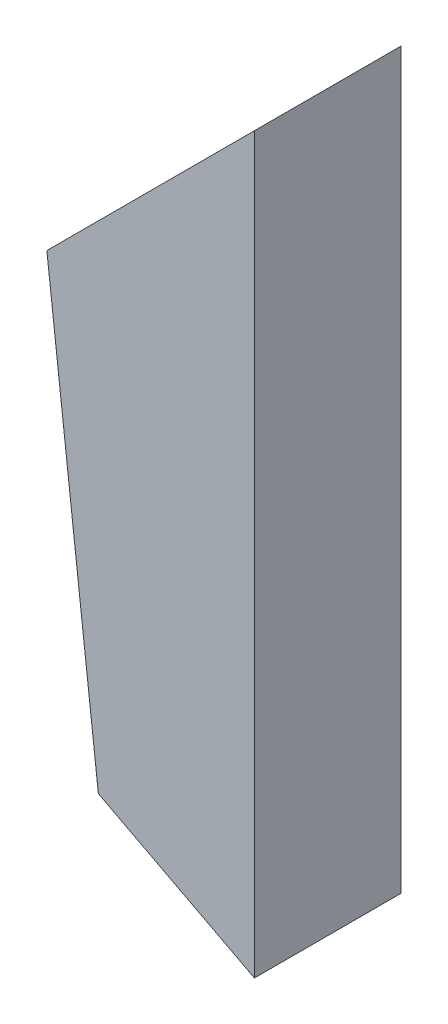
ISO-10303-21;
HEADER;
FILE_DESCRIPTION(('STEP AP214'),'2;1');
FILE_NAME('part.step','',(''),(''),'','','');
FILE_SCHEMA(('AUTOMOTIVE_DESIGN { 1 0 10303 214 1 1 1 1 }'));
ENDSEC;
DATA;
#1=APPLICATION_CONTEXT('core data for automotive mechanical design processes');
#2=APPLICATION_PROTOCOL_DEFINITION('international standard','automotive_design',2000,#1);
#3=PRODUCT_CONTEXT('',#1,'mechanical');
#4=PRODUCT('Part','Part','',(#3));
#5=PRODUCT_RELATED_PRODUCT_CATEGORY('part','',(#4));
#6=PRODUCT_DEFINITION_FORMATION('','',#4);
#7=PRODUCT_DEFINITION_CONTEXT('part definition',#1,'design');
#8=PRODUCT_DEFINITION('design','',#6,#7);
#9=PRODUCT_DEFINITION_SHAPE('','',#8);
#10=(LENGTH_UNIT() NAMED_UNIT(*) SI_UNIT(.MILLI.,.METRE.));
#11=(NAMED_UNIT(*) PLANE_ANGLE_UNIT() SI_UNIT($,.RADIAN.));
#12=(NAMED_UNIT(*) SI_UNIT($,.STERADIAN.) SOLID_ANGLE_UNIT());
#13=UNCERTAINTY_MEASURE_WITH_UNIT(LENGTH_MEASURE(1.E-05),#10,'distance_accuracy_value','');
#14=(GEOMETRIC_REPRESENTATION_CONTEXT(3) GLOBAL_UNCERTAINTY_ASSIGNED_CONTEXT((#13)) GLOBAL_UNIT_ASSIGNED_CONTEXT((#10,
#11,#12)) REPRESENTATION_CONTEXT('',''));
#15=CARTESIAN_POINT('',(0.,0.,0.));
#16=DIRECTION('',(0.,0.,1.));
#17=DIRECTION('',(1.,0.,0.));
#18=AXIS2_PLACEMENT_3D('',#15,#16,#17);
#19=CARTESIAN_POINT('',(3.50999790711884,-30.293904673414,10.));
#20=DIRECTION('',(0.993354507122263,0.115094844280213,0.));
#21=DIRECTION('',(-0.115094844280213,0.993354507122263,0.));
#22=AXIS2_PLACEMENT_3D('',#19,#20,#21);
#23=PLANE('',#22);
#24=DIRECTION('',(0.115094844280213,-0.993354507122263,0.));
#25=VECTOR('',#24,1.);
#26=CARTESIAN_POINT('',(3.50999790711884,-30.293904673414,0.));
#27=LINE('',#26,#25);
#28=CARTESIAN_POINT('',(0.,0.,0.));
#29=VERTEX_POINT('',#28);
#30=CARTESIAN_POINT('',(3.50999790711884,-30.293904673414,0.));
#31=VERTEX_POINT('',#30);
#32=EDGE_CURVE('E96',#29,#31,#27,.T.);
#33=ORIENTED_EDGE('',*,*,#32,.T.);
#34=DIRECTION('',(0.,0.,-1.));
#35=VECTOR('',#34,1.);
#36=CARTESIAN_POINT('',(3.50999790711884,-30.293904673414,10.));
#37=LINE('',#36,#35);
#38=CARTESIAN_POINT('',(3.50999790711884,-30.293904673414,10.));
#39=VERTEX_POINT('',#38);
#40=EDGE_CURVE('E11',#39,#31,#37,.T.);
#41=ORIENTED_EDGE('',*,*,#40,.F.);
#42=DIRECTION('',(0.115094844280213,-0.993354507122263,0.));
#43=VECTOR('',#42,1.);
#44=CARTESIAN_POINT('',(3.50999790711884,-30.293904673414,10.));
#45=LINE('',#44,#43);
#46=CARTESIAN_POINT('',(0.,0.,10.));
#47=VERTEX_POINT('',#46);
#48=EDGE_CURVE('E84',#47,#39,#45,.T.);
#49=ORIENTED_EDGE('',*,*,#48,.F.);
#50=DIRECTION('',(0.,0.,-1.));
#51=VECTOR('',#50,1.);
#52=CARTESIAN_POINT('',(0.,0.,10.));
#53=LINE('',#52,#51);
#54=EDGE_CURVE('E92',#47,#29,#53,.T.);
#55=ORIENTED_EDGE('',*,*,#54,.T.);
#56=EDGE_LOOP('',(#33,#41,#49,#55));
#57=FACE_BOUND('',#56,.T.);
#58=ADVANCED_FACE('F33',(#57),#23,.F.);
#59=CARTESIAN_POINT('',(14.1421356237309,-35.857864376269,10.));
#60=DIRECTION('',(0.463663308571252,0.886011476384341,0.));
#61=DIRECTION('',(-0.886011476384341,0.463663308571252,0.));
#62=AXIS2_PLACEMENT_3D('',#59,#60,#61);
#63=PLANE('',#62);
#64=DIRECTION('',(0.886011476384341,-0.463663308571252,0.));
#65=VECTOR('',#64,1.);
#66=CARTESIAN_POINT('',(14.1421356237309,-35.857864376269,0.));
#67=LINE('',#66,#65);
#68=CARTESIAN_POINT('',(14.1421356237309,-35.857864376269,0.));
#69=VERTEX_POINT('',#68);
#70=EDGE_CURVE('E88',#31,#69,#67,.T.);
#71=ORIENTED_EDGE('',*,*,#70,.T.);
#72=DIRECTION('',(0.,0.,-1.));
#73=VECTOR('',#72,1.);
#74=CARTESIAN_POINT('',(14.1421356237309,-35.857864376269,10.));
#75=LINE('',#74,#73);
#76=CARTESIAN_POINT('',(14.1421356237309,-35.857864376269,10.));
#77=VERTEX_POINT('',#76);
#78=EDGE_CURVE('E41',#77,#69,#75,.T.);
#79=ORIENTED_EDGE('',*,*,#78,.F.);
#80=DIRECTION('',(0.886011476384341,-0.463663308571252,0.));
#81=VECTOR('',#80,1.);
#82=CARTESIAN_POINT('',(14.1421356237309,-35.857864376269,10.));
#83=LINE('',#82,#81);
#84=EDGE_CURVE('E79',#39,#77,#83,.T.);
#85=ORIENTED_EDGE('',*,*,#84,.F.);
#86=ORIENTED_EDGE('',*,*,#40,.T.);
#87=EDGE_LOOP('',(#71,#79,#85,#86));
#88=FACE_BOUND('',#87,.T.);
#89=ADVANCED_FACE('F87',(#88),#63,.F.);
#90=CARTESIAN_POINT('',(14.1421356237309,14.142135623731,10.));
#91=DIRECTION('',(-1.,0.,0.));
#92=DIRECTION('',(0.,-1.,0.));
#93=AXIS2_PLACEMENT_3D('',#90,#91,#92);
#94=PLANE('',#93);
#95=DIRECTION('',(0.,1.,0.));
#96=VECTOR('',#95,1.);
#97=CARTESIAN_POINT('',(14.1421356237309,14.142135623731,0.));
#98=LINE('',#97,#96);
#99=CARTESIAN_POINT('',(14.1421356237309,14.142135623731,0.));
#100=VERTEX_POINT('',#99);
#101=EDGE_CURVE('E66',#69,#100,#98,.T.);
#102=ORIENTED_EDGE('',*,*,#101,.T.);
#103=DIRECTION('',(0.,0.,-1.));
#104=VECTOR('',#103,1.);
#105=CARTESIAN_POINT('',(14.1421356237309,14.142135623731,10.));
#106=LINE('',#105,#104);
#107=CARTESIAN_POINT('',(14.1421356237309,14.142135623731,10.));
#108=VERTEX_POINT('',#107);
#109=EDGE_CURVE('E89',#108,#100,#106,.T.);
#110=ORIENTED_EDGE('',*,*,#109,.F.);
#111=DIRECTION('',(0.,1.,0.));
#112=VECTOR('',#111,1.);
#113=CARTESIAN_POINT('',(14.1421356237309,14.142135623731,10.));
#114=LINE('',#113,#112);
#115=EDGE_CURVE('E82',#77,#108,#114,.T.);
#116=ORIENTED_EDGE('',*,*,#115,.F.);
#117=ORIENTED_EDGE('',*,*,#78,.T.);
#118=EDGE_LOOP('',(#102,#110,#116,#117));
#119=FACE_BOUND('',#118,.T.);
#120=ADVANCED_FACE('F90',(#119),#94,.F.);
#121=CARTESIAN_POINT('',(0.,0.,10.));
#122=DIRECTION('',(0.707106781186549,-0.707106781186546,0.));
#123=DIRECTION('',(0.707106781186546,0.707106781186549,0.));
#124=AXIS2_PLACEMENT_3D('',#121,#122,#123);
#125=PLANE('',#124);
#126=DIRECTION('',(-0.707106781186546,-0.707106781186549,0.));
#127=VECTOR('',#126,1.);
#128=CARTESIAN_POINT('',(0.,0.,0.));
#129=LINE('',#128,#127);
#130=EDGE_CURVE('E72',#100,#29,#129,.T.);
#131=ORIENTED_EDGE('',*,*,#130,.T.);
#132=ORIENTED_EDGE('',*,*,#54,.F.);
#133=DIRECTION('',(-0.707106781186546,-0.707106781186549,0.));
#134=VECTOR('',#133,1.);
#135=CARTESIAN_POINT('',(0.,0.,10.));
#136=LINE('',#135,#134);
#137=EDGE_CURVE('E49',#108,#47,#136,.T.);
#138=ORIENTED_EDGE('',*,*,#137,.F.);
#139=ORIENTED_EDGE('',*,*,#109,.T.);
#140=EDGE_LOOP('',(#131,#132,#138,#139));
#141=FACE_BOUND('',#140,.T.);
#142=ADVANCED_FACE('F103',(#141),#125,.F.);
#143=CARTESIAN_POINT('',(0.,0.,10.));
#144=DIRECTION('',(0.,0.,1.));
#145=DIRECTION('',(1.,0.,0.));
#146=AXIS2_PLACEMENT_3D('',#143,#144,#145);
#147=PLANE('',#146);
#148=ORIENTED_EDGE('',*,*,#48,.T.);
#149=ORIENTED_EDGE('',*,*,#84,.T.);
#150=ORIENTED_EDGE('',*,*,#115,.T.);
#151=ORIENTED_EDGE('',*,*,#137,.T.);
#152=EDGE_LOOP('',(#148,#149,#150,#151));
#153=FACE_BOUND('',#152,.T.);
#154=ADVANCED_FACE('F80',(#153),#147,.T.);
#155=CARTESIAN_POINT('',(0.,0.,0.));
#156=DIRECTION('',(0.,0.,1.));
#157=DIRECTION('',(1.,0.,0.));
#158=AXIS2_PLACEMENT_3D('',#155,#156,#157);
#159=PLANE('',#158);
#160=ORIENTED_EDGE('',*,*,#32,.F.);
#161=ORIENTED_EDGE('',*,*,#130,.F.);
#162=ORIENTED_EDGE('',*,*,#101,.F.);
#163=ORIENTED_EDGE('',*,*,#70,.F.);
#164=EDGE_LOOP('',(#160,#161,#162,#163));
#165=FACE_BOUND('',#164,.T.);
#166=ADVANCED_FACE('F106',(#165),#159,.F.);
#167=CLOSED_SHELL('',(#58,#89,#120,#142,#154,#166));
#168=MANIFOLD_SOLID_BREP('B2',#167);
#169=ADVANCED_BREP_SHAPE_REPRESENTATION('',(#18,#168),#14);
#170=SHAPE_DEFINITION_REPRESENTATION(#9,#169);
ENDSEC;
END-ISO-10303-21;
